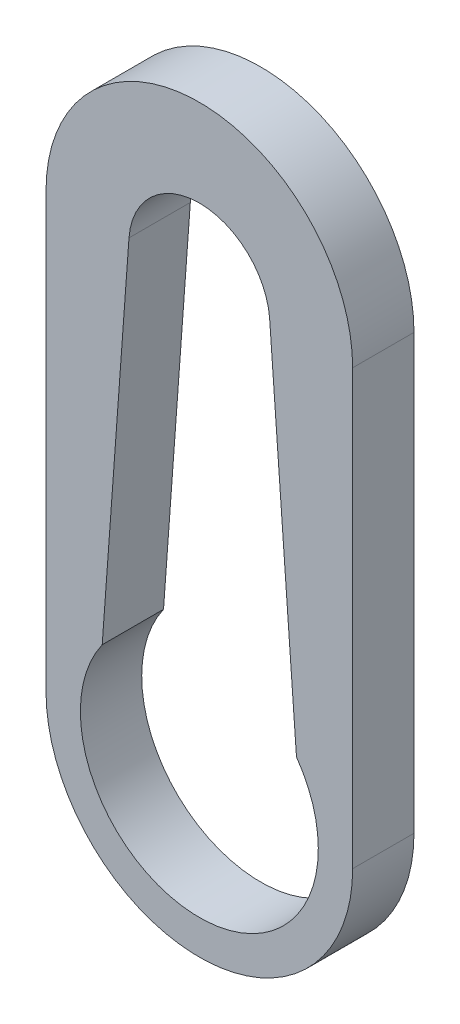
ISO-10303-21;
HEADER;
FILE_DESCRIPTION(('STEP AP214'),'2;1');
FILE_NAME('part.step','',(''),(''),'','','');
FILE_SCHEMA(('AUTOMOTIVE_DESIGN { 1 0 10303 214 1 1 1 1 }'));
ENDSEC;
DATA;
#1=APPLICATION_CONTEXT('core data for automotive mechanical design processes');
#2=APPLICATION_PROTOCOL_DEFINITION('international standard','automotive_design',2000,#1);
#3=PRODUCT_CONTEXT('',#1,'mechanical');
#4=PRODUCT('Part','Part','',(#3));
#5=PRODUCT_RELATED_PRODUCT_CATEGORY('part','',(#4));
#6=PRODUCT_DEFINITION_FORMATION('','',#4);
#7=PRODUCT_DEFINITION_CONTEXT('part definition',#1,'design');
#8=PRODUCT_DEFINITION('design','',#6,#7);
#9=PRODUCT_DEFINITION_SHAPE('','',#8);
#10=(LENGTH_UNIT() NAMED_UNIT(*) SI_UNIT(.MILLI.,.METRE.));
#11=(NAMED_UNIT(*) PLANE_ANGLE_UNIT() SI_UNIT($,.RADIAN.));
#12=(NAMED_UNIT(*) SI_UNIT($,.STERADIAN.) SOLID_ANGLE_UNIT());
#13=UNCERTAINTY_MEASURE_WITH_UNIT(LENGTH_MEASURE(1.E-05),#10,'distance_accuracy_value','');
#14=(GEOMETRIC_REPRESENTATION_CONTEXT(3) GLOBAL_UNCERTAINTY_ASSIGNED_CONTEXT((#13)) GLOBAL_UNIT_ASSIGNED_CONTEXT((#10,
#11,#12)) REPRESENTATION_CONTEXT('',''));
#15=CARTESIAN_POINT('',(0.,0.,0.));
#16=DIRECTION('',(0.,0.,1.));
#17=DIRECTION('',(1.,0.,0.));
#18=AXIS2_PLACEMENT_3D('',#15,#16,#17);
#19=CARTESIAN_POINT('',(72.4721443234768,-5.31098134370387,2.));
#20=DIRECTION('',(0.997325563012705,-0.0730870806736097,0.));
#21=DIRECTION('',(0.0730870806736097,0.997325563012705,0.));
#22=AXIS2_PLACEMENT_3D('',#19,#20,#21);
#23=PLANE('',#22);
#24=DIRECTION('',(-0.0730870806736097,-0.997325563012705,0.));
#25=VECTOR('',#24,1.);
#26=CARTESIAN_POINT('',(72.4721443234768,-5.31098134370387,0.));
#27=LINE('',#26,#25);
#28=CARTESIAN_POINT('',(78.2915937412097,74.0995740304149,0.));
#29=VERTEX_POINT('',#28);
#30=CARTESIAN_POINT('',(77.4174787756433,62.1716492571638,0.));
#31=VERTEX_POINT('',#30);
#32=EDGE_CURVE('E153',#29,#31,#27,.T.);
#33=ORIENTED_EDGE('',*,*,#32,.F.);
#34=DIRECTION('',(0.,0.,-1.));
#35=VECTOR('',#34,1.);
#36=CARTESIAN_POINT('',(78.2915937412097,74.0995740304149,2.));
#37=LINE('',#36,#35);
#38=CARTESIAN_POINT('',(78.2915937412097,74.0995740304149,2.));
#39=VERTEX_POINT('',#38);
#40=EDGE_CURVE('E11',#39,#29,#37,.T.);
#41=ORIENTED_EDGE('',*,*,#40,.F.);
#42=DIRECTION('',(-0.0730870806736097,-0.997325563012705,0.));
#43=VECTOR('',#42,1.);
#44=CARTESIAN_POINT('',(72.4721443234768,-5.31098134370387,2.));
#45=LINE('',#44,#43);
#46=CARTESIAN_POINT('',(77.4174787756433,62.1716492571638,2.));
#47=VERTEX_POINT('',#46);
#48=EDGE_CURVE('E123',#39,#47,#45,.T.);
#49=ORIENTED_EDGE('',*,*,#48,.T.);
#50=DIRECTION('',(0.,0.,-1.));
#51=VECTOR('',#50,1.);
#52=CARTESIAN_POINT('',(77.4174787756433,62.1716492571638,2.));
#53=LINE('',#52,#51);
#54=EDGE_CURVE('E57',#47,#31,#53,.T.);
#55=ORIENTED_EDGE('',*,*,#54,.T.);
#56=EDGE_LOOP('',(#33,#41,#49,#55));
#57=FACE_BOUND('',#56,.T.);
#58=ADVANCED_FACE('F38',(#57),#23,.T.);
#59=CARTESIAN_POINT('',(80.585439946269,73.9314739346592,2.));
#60=DIRECTION('',(0.,0.,-1.));
#61=DIRECTION('',(-1.,0.,0.));
#62=AXIS2_PLACEMENT_3D('',#59,#60,#61);
#63=CYLINDRICAL_SURFACE('',#62,2.2999974031851);
#64=CARTESIAN_POINT('',(80.585439946269,73.9314739346592,0.));
#65=DIRECTION('',(0.,0.,1.));
#66=DIRECTION('',(1.,0.,0.));
#67=AXIS2_PLACEMENT_3D('',#64,#65,#66);
#68=CIRCLE('',#67,2.2999974031851);
#69=CARTESIAN_POINT('',(82.8792859374333,74.0995769491408,0.));
#70=VERTEX_POINT('',#69);
#71=EDGE_CURVE('E128',#29,#70,#68,.F.);
#72=ORIENTED_EDGE('',*,*,#71,.T.);
#73=DIRECTION('',(0.,0.,-1.));
#74=VECTOR('',#73,1.);
#75=CARTESIAN_POINT('',(82.8792859374333,74.0995769491408,2.));
#76=LINE('',#75,#74);
#77=CARTESIAN_POINT('',(82.8792859374333,74.0995769491408,2.));
#78=VERTEX_POINT('',#77);
#79=EDGE_CURVE('E48',#78,#70,#76,.T.);
#80=ORIENTED_EDGE('',*,*,#79,.F.);
#81=CARTESIAN_POINT('',(80.585439946269,73.9314739346592,2.));
#82=DIRECTION('',(0.,0.,1.));
#83=DIRECTION('',(1.,0.,0.));
#84=AXIS2_PLACEMENT_3D('',#81,#82,#83);
#85=CIRCLE('',#84,2.2999974031851);
#86=EDGE_CURVE('E118',#39,#78,#85,.F.);
#87=ORIENTED_EDGE('',*,*,#86,.F.);
#88=ORIENTED_EDGE('',*,*,#40,.T.);
#89=EDGE_LOOP('',(#72,#80,#87,#88));
#90=FACE_BOUND('',#89,.T.);
#91=ADVANCED_FACE('F126',(#90),#63,.F.);
#92=CARTESIAN_POINT('',(87.8378835412781,6.43714227800923,2.));
#93=DIRECTION('',(0.997325470014747,0.0730883496862764,0.));
#94=DIRECTION('',(-0.0730883496862764,0.997325470014747,0.));
#95=AXIS2_PLACEMENT_3D('',#92,#93,#94);
#96=PLANE('',#95);
#97=DIRECTION('',(0.0730883496862764,-0.997325470014747,0.));
#98=VECTOR('',#97,1.);
#99=CARTESIAN_POINT('',(87.8378835412781,6.43714227800923,0.));
#100=LINE('',#99,#98);
#101=CARTESIAN_POINT('',(83.7534163756876,62.1716492571323,0.));
#102=VERTEX_POINT('',#101);
#103=EDGE_CURVE('E150',#70,#102,#100,.T.);
#104=ORIENTED_EDGE('',*,*,#103,.T.);
#105=DIRECTION('',(0.,0.,-1.));
#106=VECTOR('',#105,1.);
#107=CARTESIAN_POINT('',(83.7534163756876,62.1716492571323,2.));
#108=LINE('',#107,#106);
#109=CARTESIAN_POINT('',(83.7534163756876,62.1716492571323,2.));
#110=VERTEX_POINT('',#109);
#111=EDGE_CURVE('E83',#110,#102,#108,.T.);
#112=ORIENTED_EDGE('',*,*,#111,.F.);
#113=DIRECTION('',(0.0730883496862764,-0.997325470014747,0.));
#114=VECTOR('',#113,1.);
#115=CARTESIAN_POINT('',(87.8378835412781,6.43714227800923,2.));
#116=LINE('',#115,#114);
#117=EDGE_CURVE('E110',#78,#110,#116,.T.);
#118=ORIENTED_EDGE('',*,*,#117,.F.);
#119=ORIENTED_EDGE('',*,*,#79,.T.);
#120=EDGE_LOOP('',(#104,#112,#118,#119));
#121=FACE_BOUND('',#120,.T.);
#122=ADVANCED_FACE('F112',(#121),#96,.F.);
#123=CARTESIAN_POINT('',(75.5854475540437,0.,2.));
#124=DIRECTION('',(-1.,0.,0.));
#125=DIRECTION('',(0.,0.,1.));
#126=AXIS2_PLACEMENT_3D('',#123,#124,#125);
#127=PLANE('',#126);
#128=DIRECTION('',(0.,1.,0.));
#129=VECTOR('',#128,1.);
#130=CARTESIAN_POINT('',(75.5854475540437,0.,0.));
#131=LINE('',#130,#129);
#132=CARTESIAN_POINT('',(75.5854475540437,59.9314759153053,0.));
#133=VERTEX_POINT('',#132);
#134=CARTESIAN_POINT('',(75.5854475540437,74.0776474853053,0.));
#135=VERTEX_POINT('',#134);
#136=EDGE_CURVE('E162',#133,#135,#131,.T.);
#137=ORIENTED_EDGE('',*,*,#136,.F.);
#138=DIRECTION('',(0.,0.,-1.));
#139=VECTOR('',#138,1.);
#140=CARTESIAN_POINT('',(75.5854475540437,59.9314759153053,2.));
#141=LINE('',#140,#139);
#142=CARTESIAN_POINT('',(75.5854475540437,59.9314759153053,2.));
#143=VERTEX_POINT('',#142);
#144=EDGE_CURVE('E42',#143,#133,#141,.T.);
#145=ORIENTED_EDGE('',*,*,#144,.F.);
#146=DIRECTION('',(0.,1.,0.));
#147=VECTOR('',#146,1.);
#148=CARTESIAN_POINT('',(75.5854475540437,0.,2.));
#149=LINE('',#148,#147);
#150=CARTESIAN_POINT('',(75.5854475540437,74.0776474853053,2.));
#151=VERTEX_POINT('',#150);
#152=EDGE_CURVE('E149',#143,#151,#149,.T.);
#153=ORIENTED_EDGE('',*,*,#152,.T.);
#154=DIRECTION('',(0.,0.,-1.));
#155=VECTOR('',#154,1.);
#156=CARTESIAN_POINT('',(75.5854475540437,74.0776474853053,2.));
#157=LINE('',#156,#155);
#158=EDGE_CURVE('E133',#151,#135,#157,.T.);
#159=ORIENTED_EDGE('',*,*,#158,.T.);
#160=EDGE_LOOP('',(#137,#145,#153,#159));
#161=FACE_BOUND('',#160,.T.);
#162=ADVANCED_FACE('F40',(#161),#127,.T.);
#163=CARTESIAN_POINT('',(80.5854475540437,59.9314759153053,2.));
#164=DIRECTION('',(0.,0.,-1.));
#165=DIRECTION('',(-1.,0.,0.));
#166=AXIS2_PLACEMENT_3D('',#163,#164,#165);
#167=CYLINDRICAL_SURFACE('',#166,5.);
#168=CARTESIAN_POINT('',(80.5854475540437,59.9314759153053,0.));
#169=DIRECTION('',(0.,0.,1.));
#170=DIRECTION('',(1.,0.,0.));
#171=AXIS2_PLACEMENT_3D('',#168,#169,#170);
#172=CIRCLE('',#171,5.);
#173=CARTESIAN_POINT('',(85.5854475540437,59.9314759153053,0.));
#174=VERTEX_POINT('',#173);
#175=EDGE_CURVE('E160',#133,#174,#172,.T.);
#176=ORIENTED_EDGE('',*,*,#175,.T.);
#177=DIRECTION('',(0.,0.,-1.));
#178=VECTOR('',#177,1.);
#179=CARTESIAN_POINT('',(85.5854475540437,59.9314759153053,2.));
#180=LINE('',#179,#178);
#181=CARTESIAN_POINT('',(85.5854475540437,59.9314759153053,2.));
#182=VERTEX_POINT('',#181);
#183=EDGE_CURVE('E136',#182,#174,#180,.T.);
#184=ORIENTED_EDGE('',*,*,#183,.F.);
#185=CARTESIAN_POINT('',(80.5854475540437,59.9314759153053,2.));
#186=DIRECTION('',(0.,0.,1.));
#187=DIRECTION('',(1.,0.,0.));
#188=AXIS2_PLACEMENT_3D('',#185,#186,#187);
#189=CIRCLE('',#188,5.);
#190=EDGE_CURVE('E172',#143,#182,#189,.T.);
#191=ORIENTED_EDGE('',*,*,#190,.F.);
#192=ORIENTED_EDGE('',*,*,#144,.T.);
#193=EDGE_LOOP('',(#176,#184,#191,#192));
#194=FACE_BOUND('',#193,.T.);
#195=ADVANCED_FACE('F184',(#194),#167,.T.);
#196=CARTESIAN_POINT('',(85.5854475540437,0.,2.));
#197=DIRECTION('',(-1.,0.,0.));
#198=DIRECTION('',(0.,-1.,0.));
#199=AXIS2_PLACEMENT_3D('',#196,#197,#198);
#200=PLANE('',#199);
#201=DIRECTION('',(0.,1.,0.));
#202=VECTOR('',#201,1.);
#203=CARTESIAN_POINT('',(85.5854475540437,0.,0.));
#204=LINE('',#203,#202);
#205=CARTESIAN_POINT('',(85.5854475540437,74.0776474853053,0.));
#206=VERTEX_POINT('',#205);
#207=EDGE_CURVE('E158',#174,#206,#204,.T.);
#208=ORIENTED_EDGE('',*,*,#207,.T.);
#209=DIRECTION('',(0.,0.,-1.));
#210=VECTOR('',#209,1.);
#211=CARTESIAN_POINT('',(85.5854475540437,74.0776474853053,2.));
#212=LINE('',#211,#210);
#213=CARTESIAN_POINT('',(85.5854475540437,74.0776474853053,2.));
#214=VERTEX_POINT('',#213);
#215=EDGE_CURVE('E135',#214,#206,#212,.T.);
#216=ORIENTED_EDGE('',*,*,#215,.F.);
#217=DIRECTION('',(0.,1.,0.));
#218=VECTOR('',#217,1.);
#219=CARTESIAN_POINT('',(85.5854475540437,0.,2.));
#220=LINE('',#219,#218);
#221=EDGE_CURVE('E170',#182,#214,#220,.T.);
#222=ORIENTED_EDGE('',*,*,#221,.F.);
#223=ORIENTED_EDGE('',*,*,#183,.T.);
#224=EDGE_LOOP('',(#208,#216,#222,#223));
#225=FACE_BOUND('',#224,.T.);
#226=ADVANCED_FACE('F185',(#225),#200,.F.);
#227=CARTESIAN_POINT('',(80.5854475540437,74.0776474853053,2.));
#228=DIRECTION('',(0.,0.,-1.));
#229=DIRECTION('',(-1.,0.,0.));
#230=AXIS2_PLACEMENT_3D('',#227,#228,#229);
#231=CYLINDRICAL_SURFACE('',#230,5.);
#232=CARTESIAN_POINT('',(80.5854475540437,74.0776474853053,0.));
#233=DIRECTION('',(0.,0.,1.));
#234=DIRECTION('',(1.,0.,0.));
#235=AXIS2_PLACEMENT_3D('',#232,#233,#234);
#236=CIRCLE('',#235,5.);
#237=EDGE_CURVE('E155',#135,#206,#236,.F.);
#238=ORIENTED_EDGE('',*,*,#237,.F.);
#239=ORIENTED_EDGE('',*,*,#158,.F.);
#240=CARTESIAN_POINT('',(80.5854475540437,74.0776474853053,2.));
#241=DIRECTION('',(0.,0.,1.));
#242=DIRECTION('',(1.,0.,0.));
#243=AXIS2_PLACEMENT_3D('',#240,#241,#242);
#244=CIRCLE('',#243,5.);
#245=EDGE_CURVE('E167',#151,#214,#244,.F.);
#246=ORIENTED_EDGE('',*,*,#245,.T.);
#247=ORIENTED_EDGE('',*,*,#215,.T.);
#248=EDGE_LOOP('',(#238,#239,#246,#247));
#249=FACE_BOUND('',#248,.T.);
#250=ADVANCED_FACE('F180',(#249),#231,.T.);
#251=CARTESIAN_POINT('',(80.5854475756543,59.9324069825937,2.));
#252=DIRECTION('',(0.,0.,-1.));
#253=DIRECTION('',(-1.,0.,0.));
#254=AXIS2_PLACEMENT_3D('',#251,#252,#253);
#255=CYLINDRICAL_SURFACE('',#254,3.87946288576974);
#256=CARTESIAN_POINT('',(80.5854475756543,59.9324069825937,0.));
#257=DIRECTION('',(0.,0.,1.));
#258=DIRECTION('',(1.,0.,0.));
#259=AXIS2_PLACEMENT_3D('',#256,#257,#258);
#260=CIRCLE('',#259,3.87946288576974);
#261=EDGE_CURVE('E146',#31,#102,#260,.T.);
#262=ORIENTED_EDGE('',*,*,#261,.F.);
#263=ORIENTED_EDGE('',*,*,#54,.F.);
#264=CARTESIAN_POINT('',(80.5854475756543,59.9324069825937,2.));
#265=DIRECTION('',(0.,0.,1.));
#266=DIRECTION('',(1.,0.,0.));
#267=AXIS2_PLACEMENT_3D('',#264,#265,#266);
#268=CIRCLE('',#267,3.87946288576974);
#269=EDGE_CURVE('E117',#47,#110,#268,.T.);
#270=ORIENTED_EDGE('',*,*,#269,.T.);
#271=ORIENTED_EDGE('',*,*,#111,.T.);
#272=EDGE_LOOP('',(#262,#263,#270,#271));
#273=FACE_BOUND('',#272,.T.);
#274=ADVANCED_FACE('F192',(#273),#255,.F.);
#275=CARTESIAN_POINT('',(0.,0.,2.));
#276=DIRECTION('',(0.,0.,1.));
#277=DIRECTION('',(1.,0.,0.));
#278=AXIS2_PLACEMENT_3D('',#275,#276,#277);
#279=PLANE('',#278);
#280=ORIENTED_EDGE('',*,*,#152,.F.);
#281=ORIENTED_EDGE('',*,*,#190,.T.);
#282=ORIENTED_EDGE('',*,*,#221,.T.);
#283=ORIENTED_EDGE('',*,*,#245,.F.);
#284=EDGE_LOOP('',(#280,#281,#282,#283));
#285=FACE_BOUND('',#284,.T.);
#286=ORIENTED_EDGE('',*,*,#48,.F.);
#287=ORIENTED_EDGE('',*,*,#86,.T.);
#288=ORIENTED_EDGE('',*,*,#117,.T.);
#289=ORIENTED_EDGE('',*,*,#269,.F.);
#290=EDGE_LOOP('',(#286,#287,#288,#289));
#291=FACE_BOUND('',#290,.T.);
#292=ADVANCED_FACE('F122',(#285,#291),#279,.T.);
#293=CARTESIAN_POINT('',(0.,0.,0.));
#294=DIRECTION('',(0.,0.,1.));
#295=DIRECTION('',(1.,0.,0.));
#296=AXIS2_PLACEMENT_3D('',#293,#294,#295);
#297=PLANE('',#296);
#298=ORIENTED_EDGE('',*,*,#136,.T.);
#299=ORIENTED_EDGE('',*,*,#237,.T.);
#300=ORIENTED_EDGE('',*,*,#207,.F.);
#301=ORIENTED_EDGE('',*,*,#175,.F.);
#302=EDGE_LOOP('',(#298,#299,#300,#301));
#303=FACE_BOUND('',#302,.T.);
#304=ORIENTED_EDGE('',*,*,#32,.T.);
#305=ORIENTED_EDGE('',*,*,#261,.T.);
#306=ORIENTED_EDGE('',*,*,#103,.F.);
#307=ORIENTED_EDGE('',*,*,#71,.F.);
#308=EDGE_LOOP('',(#304,#305,#306,#307));
#309=FACE_BOUND('',#308,.T.);
#310=ADVANCED_FACE('F182',(#303,#309),#297,.F.);
#311=CLOSED_SHELL('',(#58,#91,#122,#162,#195,#226,#250,#274,#292,#310));
#312=MANIFOLD_SOLID_BREP('B2',#311);
#313=ADVANCED_BREP_SHAPE_REPRESENTATION('',(#18,#312),#14);
#314=SHAPE_DEFINITION_REPRESENTATION(#9,#313);
ENDSEC;
END-ISO-10303-21;
